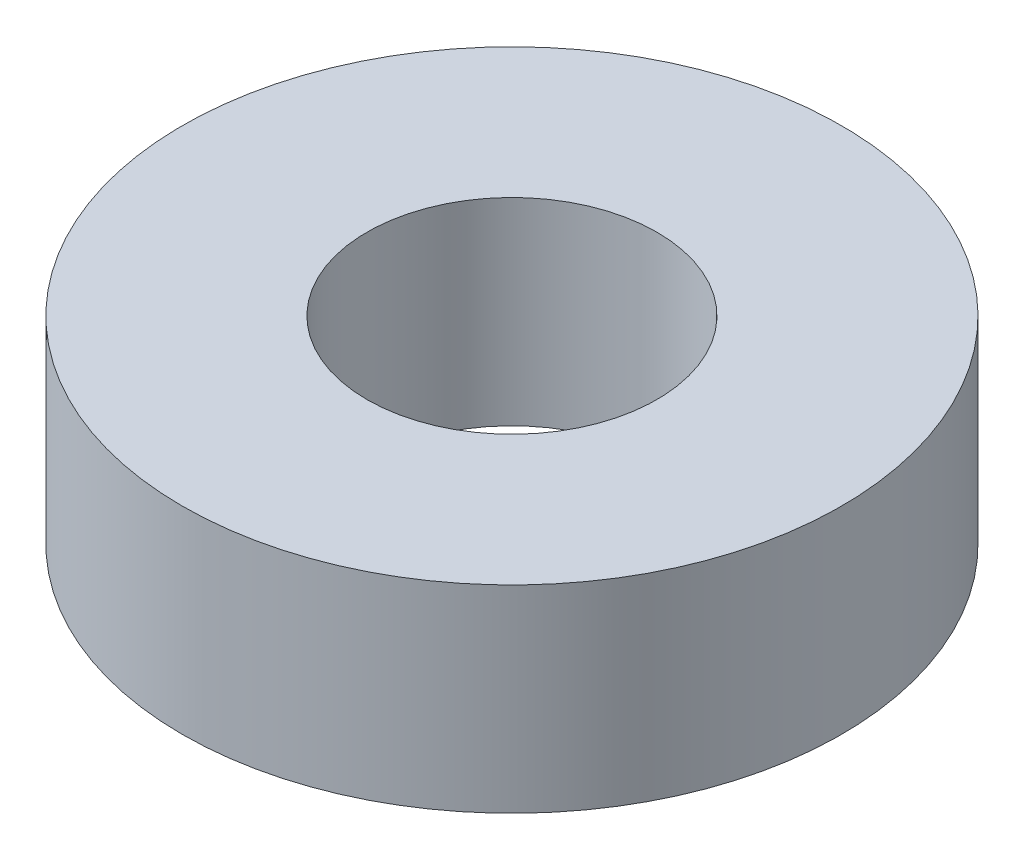
ISO-10303-21;
HEADER;
FILE_DESCRIPTION(('STEP AP214'),'2;1');
FILE_NAME('part.step','',(''),(''),'','','');
FILE_SCHEMA(('AUTOMOTIVE_DESIGN { 1 0 10303 214 1 1 1 1 }'));
ENDSEC;
DATA;
#1=APPLICATION_CONTEXT('core data for automotive mechanical design processes');
#2=APPLICATION_PROTOCOL_DEFINITION('international standard','automotive_design',2000,#1);
#3=PRODUCT_CONTEXT('',#1,'mechanical');
#4=PRODUCT('Part','Part','',(#3));
#5=PRODUCT_RELATED_PRODUCT_CATEGORY('part','',(#4));
#6=PRODUCT_DEFINITION_FORMATION('','',#4);
#7=PRODUCT_DEFINITION_CONTEXT('part definition',#1,'design');
#8=PRODUCT_DEFINITION('design','',#6,#7);
#9=PRODUCT_DEFINITION_SHAPE('','',#8);
#10=(LENGTH_UNIT() NAMED_UNIT(*) SI_UNIT(.MILLI.,.METRE.));
#11=(NAMED_UNIT(*) PLANE_ANGLE_UNIT() SI_UNIT($,.RADIAN.));
#12=(NAMED_UNIT(*) SI_UNIT($,.STERADIAN.) SOLID_ANGLE_UNIT());
#13=UNCERTAINTY_MEASURE_WITH_UNIT(LENGTH_MEASURE(1.E-05),#10,'distance_accuracy_value','');
#14=(GEOMETRIC_REPRESENTATION_CONTEXT(3) GLOBAL_UNCERTAINTY_ASSIGNED_CONTEXT((#13)) GLOBAL_UNIT_ASSIGNED_CONTEXT((#10,
#11,#12)) REPRESENTATION_CONTEXT('',''));
#15=CARTESIAN_POINT('',(0.,0.,0.));
#16=DIRECTION('',(0.,0.,1.));
#17=DIRECTION('',(1.,0.,0.));
#18=AXIS2_PLACEMENT_3D('',#15,#16,#17);
#19=CARTESIAN_POINT('',(0.,1.5,0.));
#20=DIRECTION('',(0.,1.,0.));
#21=DIRECTION('',(0.,0.,1.));
#22=AXIS2_PLACEMENT_3D('',#19,#20,#21);
#23=PLANE('',#22);
#24=CARTESIAN_POINT('',(0.,1.5,0.));
#25=DIRECTION('',(0.,1.,0.));
#26=DIRECTION('',(0.,0.,1.));
#27=AXIS2_PLACEMENT_3D('',#24,#25,#26);
#28=CIRCLE('',#27,2.5);
#29=CARTESIAN_POINT('',(0.,1.5,2.5));
#30=VERTEX_POINT('',#29);
#31=EDGE_CURVE('E10',#30,#30,#28,.T.);
#32=ORIENTED_EDGE('',*,*,#31,.T.);
#33=EDGE_LOOP('',(#32));
#34=FACE_BOUND('',#33,.T.);
#35=CARTESIAN_POINT('',(0.,1.5,0.));
#36=DIRECTION('',(0.,1.,0.));
#37=DIRECTION('',(0.,0.,1.));
#38=AXIS2_PLACEMENT_3D('',#35,#36,#37);
#39=CIRCLE('',#38,1.1);
#40=CARTESIAN_POINT('',(0.,1.5,1.1));
#41=VERTEX_POINT('',#40);
#42=EDGE_CURVE('E48',#41,#41,#39,.T.);
#43=ORIENTED_EDGE('',*,*,#42,.F.);
#44=EDGE_LOOP('',(#43));
#45=FACE_BOUND('',#44,.T.);
#46=ADVANCED_FACE('F37',(#34,#45),#23,.T.);
#47=CARTESIAN_POINT('',(0.,0.,0.));
#48=DIRECTION('',(0.,1.,0.));
#49=DIRECTION('',(0.,0.,1.));
#50=AXIS2_PLACEMENT_3D('',#47,#48,#49);
#51=PLANE('',#50);
#52=CARTESIAN_POINT('',(0.,0.,0.));
#53=DIRECTION('',(0.,1.,0.));
#54=DIRECTION('',(0.,0.,1.));
#55=AXIS2_PLACEMENT_3D('',#52,#53,#54);
#56=CIRCLE('',#55,2.5);
#57=CARTESIAN_POINT('',(0.,0.,2.5));
#58=VERTEX_POINT('',#57);
#59=EDGE_CURVE('E41',#58,#58,#56,.T.);
#60=ORIENTED_EDGE('',*,*,#59,.F.);
#61=EDGE_LOOP('',(#60));
#62=FACE_BOUND('',#61,.T.);
#63=CARTESIAN_POINT('',(0.,0.,0.));
#64=DIRECTION('',(0.,1.,0.));
#65=DIRECTION('',(0.,0.,1.));
#66=AXIS2_PLACEMENT_3D('',#63,#64,#65);
#67=CIRCLE('',#66,1.1);
#68=CARTESIAN_POINT('',(0.,0.,1.1));
#69=VERTEX_POINT('',#68);
#70=EDGE_CURVE('E50',#69,#69,#67,.T.);
#71=ORIENTED_EDGE('',*,*,#70,.T.);
#72=EDGE_LOOP('',(#71));
#73=FACE_BOUND('',#72,.T.);
#74=ADVANCED_FACE('F60',(#62,#73),#51,.F.);
#75=CARTESIAN_POINT('',(0.,1.5,0.));
#76=DIRECTION('',(0.,-1.,0.));
#77=DIRECTION('',(0.,0.,-1.));
#78=AXIS2_PLACEMENT_3D('',#75,#76,#77);
#79=CYLINDRICAL_SURFACE('',#78,2.5);
#80=ORIENTED_EDGE('',*,*,#31,.F.);
#81=EDGE_LOOP('',(#80));
#82=FACE_BOUND('',#81,.T.);
#83=ORIENTED_EDGE('',*,*,#59,.T.);
#84=EDGE_LOOP('',(#83));
#85=FACE_BOUND('',#84,.T.);
#86=ADVANCED_FACE('F39',(#82,#85),#79,.T.);
#87=CARTESIAN_POINT('',(0.,1.5,0.));
#88=DIRECTION('',(0.,-1.,0.));
#89=DIRECTION('',(0.,0.,-1.));
#90=AXIS2_PLACEMENT_3D('',#87,#88,#89);
#91=CYLINDRICAL_SURFACE('',#90,1.1);
#92=ORIENTED_EDGE('',*,*,#42,.T.);
#93=EDGE_LOOP('',(#92));
#94=FACE_BOUND('',#93,.T.);
#95=ORIENTED_EDGE('',*,*,#70,.F.);
#96=EDGE_LOOP('',(#95));
#97=FACE_BOUND('',#96,.T.);
#98=ADVANCED_FACE('F56',(#94,#97),#91,.F.);
#99=CLOSED_SHELL('',(#46,#74,#86,#98));
#100=MANIFOLD_SOLID_BREP('B2',#99);
#101=ADVANCED_BREP_SHAPE_REPRESENTATION('',(#18,#100),#14);
#102=SHAPE_DEFINITION_REPRESENTATION(#9,#101);
ENDSEC;
END-ISO-10303-21;
